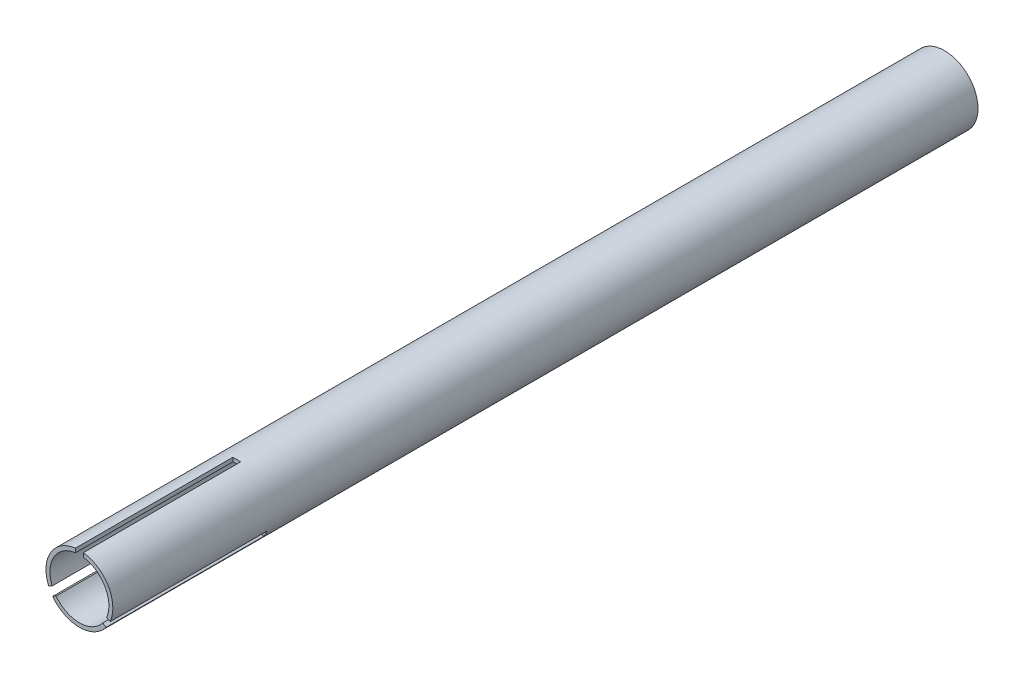
ISO-10303-21;
HEADER;
FILE_DESCRIPTION(('STEP AP214'),'2;1');
FILE_NAME('part.step','',(''),(''),'','','');
FILE_SCHEMA(('AUTOMOTIVE_DESIGN { 1 0 10303 214 1 1 1 1 }'));
ENDSEC;
DATA;
#1=APPLICATION_CONTEXT('core data for automotive mechanical design processes');
#2=APPLICATION_PROTOCOL_DEFINITION('international standard','automotive_design',2000,#1);
#3=PRODUCT_CONTEXT('',#1,'mechanical');
#4=PRODUCT('Part','Part','',(#3));
#5=PRODUCT_RELATED_PRODUCT_CATEGORY('part','',(#4));
#6=PRODUCT_DEFINITION_FORMATION('','',#4);
#7=PRODUCT_DEFINITION_CONTEXT('part definition',#1,'design');
#8=PRODUCT_DEFINITION('design','',#6,#7);
#9=PRODUCT_DEFINITION_SHAPE('','',#8);
#10=(LENGTH_UNIT() NAMED_UNIT(*) SI_UNIT(.MILLI.,.METRE.));
#11=(NAMED_UNIT(*) PLANE_ANGLE_UNIT() SI_UNIT($,.RADIAN.));
#12=(NAMED_UNIT(*) SI_UNIT($,.STERADIAN.) SOLID_ANGLE_UNIT());
#13=UNCERTAINTY_MEASURE_WITH_UNIT(LENGTH_MEASURE(1.E-05),#10,'distance_accuracy_value','');
#14=(GEOMETRIC_REPRESENTATION_CONTEXT(3) GLOBAL_UNCERTAINTY_ASSIGNED_CONTEXT((#13)) GLOBAL_UNIT_ASSIGNED_CONTEXT((#10,
#11,#12)) REPRESENTATION_CONTEXT('',''));
#15=CARTESIAN_POINT('',(0.,0.,0.));
#16=DIRECTION('',(0.,0.,1.));
#17=DIRECTION('',(1.,0.,0.));
#18=AXIS2_PLACEMENT_3D('',#15,#16,#17);
#19=CARTESIAN_POINT('',(0.,0.,558.8));
#20=DIRECTION('',(0.,0.,1.));
#21=DIRECTION('',(1.,0.,0.));
#22=AXIS2_PLACEMENT_3D('',#19,#20,#21);
#23=PLANE('',#22);
#24=CARTESIAN_POINT('',(0.,0.,558.8));
#25=DIRECTION('',(0.,0.,1.));
#26=DIRECTION('',(1.,0.,0.));
#27=AXIS2_PLACEMENT_3D('',#24,#25,#26);
#28=CIRCLE('',#27,19.05);
#29=CARTESIAN_POINT('',(-15.0804793507713,-11.6396581801598,558.8));
#30=VERTEX_POINT('',#29);
#31=CARTESIAN_POINT('',(15.0804793507715,-11.6396581801596,558.8));
#32=VERTEX_POINT('',#31);
#33=EDGE_CURVE('E257',#30,#32,#28,.T.);
#34=ORIENTED_EDGE('',*,*,#33,.F.);
#35=DIRECTION('',(0.866025403784436,0.500000000000004,0.));
#36=VECTOR('',#35,1.);
#37=CARTESIAN_POINT('',(-24.2724272465549,-16.9466317721675,558.8));
#38=LINE('',#37,#36);
#39=CARTESIAN_POINT('',(-17.297643226861,-12.9197383408577,558.8));
#40=VERTEX_POINT('',#39);
#41=EDGE_CURVE('E157',#40,#30,#38,.T.);
#42=ORIENTED_EDGE('',*,*,#41,.F.);
#43=CARTESIAN_POINT('',(0.,0.,558.8));
#44=DIRECTION('',(0.,0.,1.));
#45=DIRECTION('',(1.,0.,0.));
#46=AXIS2_PLACEMENT_3D('',#43,#44,#45);
#47=CIRCLE('',#46,21.59);
#48=CARTESIAN_POINT('',(17.2976432268612,-12.9197383408575,558.8));
#49=VERTEX_POINT('',#48);
#50=EDGE_CURVE('E54',#40,#49,#47,.T.);
#51=ORIENTED_EDGE('',*,*,#50,.T.);
#52=DIRECTION('',(-0.866025403784443,0.499999999999992,0.));
#53=VECTOR('',#52,1.);
#54=CARTESIAN_POINT('',(24.272427246555,-16.9466317721671,558.8));
#55=LINE('',#54,#53);
#56=EDGE_CURVE('E208',#49,#32,#55,.T.);
#57=ORIENTED_EDGE('',*,*,#56,.T.);
#58=EDGE_LOOP('',(#34,#42,#51,#57));
#59=FACE_BOUND('',#58,.T.);
#60=ADVANCED_FACE('F44',(#59),#23,.T.);
#61=CARTESIAN_POINT('',(-2.54,21.4400676304903,558.8));
#62=VERTEX_POINT('',#61);
#63=CARTESIAN_POINT('',(-19.837643226861,-8.52032928963279,558.8));
#64=VERTEX_POINT('',#63);
#65=EDGE_CURVE('E11',#62,#64,#47,.T.);
#66=ORIENTED_EDGE('',*,*,#65,.T.);
#67=DIRECTION('',(0.866025403784436,0.500000000000004,0.));
#68=VECTOR('',#67,1.);
#69=CARTESIAN_POINT('',(-26.8124272465549,-12.5472227209426,558.8));
#70=LINE('',#69,#68);
#71=CARTESIAN_POINT('',(-17.6204793507713,-7.24024912893486,558.8));
#72=VERTEX_POINT('',#71);
#73=EDGE_CURVE('E148',#64,#72,#70,.T.);
#74=ORIENTED_EDGE('',*,*,#73,.T.);
#75=CARTESIAN_POINT('',(-2.54,18.8799073090945,558.8));
#76=VERTEX_POINT('',#75);
#77=EDGE_CURVE('E163',#76,#72,#28,.T.);
#78=ORIENTED_EDGE('',*,*,#77,.F.);
#79=DIRECTION('',(0.,-1.,0.));
#80=VECTOR('',#79,1.);
#81=CARTESIAN_POINT('',(-2.54,21.591,558.8));
#82=LINE('',#81,#80);
#83=EDGE_CURVE('E243',#62,#76,#82,.T.);
#84=ORIENTED_EDGE('',*,*,#83,.F.);
#85=EDGE_LOOP('',(#66,#74,#78,#84));
#86=FACE_BOUND('',#85,.T.);
#87=ADVANCED_FACE('F308',(#86),#23,.T.);
#88=CARTESIAN_POINT('',(17.6204793507714,-7.24024912893461,558.8));
#89=VERTEX_POINT('',#88);
#90=CARTESIAN_POINT('',(2.54,18.8799073090945,558.8));
#91=VERTEX_POINT('',#90);
#92=EDGE_CURVE('E258',#89,#91,#28,.T.);
#93=ORIENTED_EDGE('',*,*,#92,.F.);
#94=DIRECTION('',(-0.866025403784443,0.499999999999992,0.));
#95=VECTOR('',#94,1.);
#96=CARTESIAN_POINT('',(26.812427246555,-12.5472227209421,558.8));
#97=LINE('',#96,#95);
#98=CARTESIAN_POINT('',(19.8376432268612,-8.52032928963251,558.8));
#99=VERTEX_POINT('',#98);
#100=EDGE_CURVE('E212',#99,#89,#97,.T.);
#101=ORIENTED_EDGE('',*,*,#100,.F.);
#102=CARTESIAN_POINT('',(2.54,21.4400676304903,558.8));
#103=VERTEX_POINT('',#102);
#104=EDGE_CURVE('E55',#99,#103,#47,.T.);
#105=ORIENTED_EDGE('',*,*,#104,.T.);
#106=DIRECTION('',(0.,-1.,0.));
#107=VECTOR('',#106,1.);
#108=CARTESIAN_POINT('',(2.54,21.591,558.8));
#109=LINE('',#108,#107);
#110=EDGE_CURVE('E239',#103,#91,#109,.T.);
#111=ORIENTED_EDGE('',*,*,#110,.T.);
#112=EDGE_LOOP('',(#93,#101,#105,#111));
#113=FACE_BOUND('',#112,.T.);
#114=ADVANCED_FACE('F285',(#113),#23,.T.);
#115=CARTESIAN_POINT('',(0.,0.,558.8));
#116=DIRECTION('',(0.,0.,-1.));
#117=DIRECTION('',(-1.,0.,0.));
#118=AXIS2_PLACEMENT_3D('',#115,#116,#117);
#119=CYLINDRICAL_SURFACE('',#118,21.59);
#120=CARTESIAN_POINT('',(0.,0.,0.));
#121=DIRECTION('',(0.,0.,1.));
#122=DIRECTION('',(1.,0.,0.));
#123=AXIS2_PLACEMENT_3D('',#120,#121,#122);
#124=CIRCLE('',#123,21.59);
#125=CARTESIAN_POINT('',(21.59,0.,0.));
#126=VERTEX_POINT('',#125);
#127=EDGE_CURVE('E48',#126,#126,#124,.T.);
#128=ORIENTED_EDGE('',*,*,#127,.T.);
#129=EDGE_LOOP('',(#128));
#130=FACE_BOUND('',#129,.T.);
#131=DIRECTION('',(0.,0.,-1.));
#132=VECTOR('',#131,1.);
#133=CARTESIAN_POINT('',(-17.297643226861,-12.9197383408577,558.8));
#134=LINE('',#133,#132);
#135=CARTESIAN_POINT('',(-17.297643226861,-12.9197383408577,457.2));
#136=VERTEX_POINT('',#135);
#137=EDGE_CURVE('E176',#40,#136,#134,.T.);
#138=ORIENTED_EDGE('',*,*,#137,.T.);
#139=CARTESIAN_POINT('',(0.,0.,457.2));
#140=DIRECTION('',(0.,0.,1.));
#141=DIRECTION('',(1.,0.,0.));
#142=AXIS2_PLACEMENT_3D('',#139,#140,#141);
#143=CIRCLE('',#142,21.59);
#144=CARTESIAN_POINT('',(-19.837643226861,-8.52032928963279,457.2));
#145=VERTEX_POINT('',#144);
#146=EDGE_CURVE('E156',#136,#145,#143,.F.);
#147=ORIENTED_EDGE('',*,*,#146,.T.);
#148=DIRECTION('',(0.,0.,-1.));
#149=VECTOR('',#148,1.);
#150=CARTESIAN_POINT('',(-19.837643226861,-8.52032928963279,558.8));
#151=LINE('',#150,#149);
#152=EDGE_CURVE('E144',#145,#64,#151,.F.);
#153=ORIENTED_EDGE('',*,*,#152,.T.);
#154=ORIENTED_EDGE('',*,*,#65,.F.);
#155=DIRECTION('',(0.,0.,-1.));
#156=VECTOR('',#155,1.);
#157=CARTESIAN_POINT('',(-2.54,21.4400676304903,558.8));
#158=LINE('',#157,#156);
#159=CARTESIAN_POINT('',(-2.54,21.4400676304903,457.2));
#160=VERTEX_POINT('',#159);
#161=EDGE_CURVE('E228',#62,#160,#158,.T.);
#162=ORIENTED_EDGE('',*,*,#161,.T.);
#163=CARTESIAN_POINT('',(0.,0.,457.2));
#164=DIRECTION('',(0.,0.,1.));
#165=DIRECTION('',(1.,0.,0.));
#166=AXIS2_PLACEMENT_3D('',#163,#164,#165);
#167=CIRCLE('',#166,21.59);
#168=CARTESIAN_POINT('',(2.54,21.4400676304903,457.2));
#169=VERTEX_POINT('',#168);
#170=EDGE_CURVE('E250',#160,#169,#167,.F.);
#171=ORIENTED_EDGE('',*,*,#170,.T.);
#172=DIRECTION('',(0.,0.,-1.));
#173=VECTOR('',#172,1.);
#174=CARTESIAN_POINT('',(2.54,21.4400676304903,558.8));
#175=LINE('',#174,#173);
#176=EDGE_CURVE('E224',#169,#103,#175,.F.);
#177=ORIENTED_EDGE('',*,*,#176,.T.);
#178=ORIENTED_EDGE('',*,*,#104,.F.);
#179=DIRECTION('',(0.,0.,-1.));
#180=VECTOR('',#179,1.);
#181=CARTESIAN_POINT('',(19.8376432268612,-8.52032928963251,558.8));
#182=LINE('',#181,#180);
#183=CARTESIAN_POINT('',(19.8376432268612,-8.52032928963251,457.2));
#184=VERTEX_POINT('',#183);
#185=EDGE_CURVE('E198',#99,#184,#182,.T.);
#186=ORIENTED_EDGE('',*,*,#185,.T.);
#187=CARTESIAN_POINT('',(0.,0.,457.2));
#188=DIRECTION('',(0.,0.,1.));
#189=DIRECTION('',(1.,0.,0.));
#190=AXIS2_PLACEMENT_3D('',#187,#188,#189);
#191=CIRCLE('',#190,21.59);
#192=CARTESIAN_POINT('',(17.2976432268612,-12.9197383408575,457.2));
#193=VERTEX_POINT('',#192);
#194=EDGE_CURVE('E165',#184,#193,#191,.F.);
#195=ORIENTED_EDGE('',*,*,#194,.T.);
#196=DIRECTION('',(0.,0.,-1.));
#197=VECTOR('',#196,1.);
#198=CARTESIAN_POINT('',(17.2976432268612,-12.9197383408575,558.8));
#199=LINE('',#198,#197);
#200=EDGE_CURVE('E194',#193,#49,#199,.F.);
#201=ORIENTED_EDGE('',*,*,#200,.T.);
#202=ORIENTED_EDGE('',*,*,#50,.F.);
#203=EDGE_LOOP('',(#138,#147,#153,#154,#162,#171,#177,#178,#186,#195,#201,#202));
#204=FACE_BOUND('',#203,.T.);
#205=ADVANCED_FACE('F46',(#130,#204),#119,.T.);
#206=CARTESIAN_POINT('',(0.,0.,558.8));
#207=DIRECTION('',(0.,0.,-1.));
#208=DIRECTION('',(-1.,0.,0.));
#209=AXIS2_PLACEMENT_3D('',#206,#207,#208);
#210=CYLINDRICAL_SURFACE('',#209,19.05);
#211=CARTESIAN_POINT('',(0.,0.,0.));
#212=DIRECTION('',(0.,0.,1.));
#213=DIRECTION('',(1.,0.,0.));
#214=AXIS2_PLACEMENT_3D('',#211,#212,#213);
#215=CIRCLE('',#214,19.05);
#216=CARTESIAN_POINT('',(19.05,0.,0.));
#217=VERTEX_POINT('',#216);
#218=EDGE_CURVE('E254',#217,#217,#215,.T.);
#219=ORIENTED_EDGE('',*,*,#218,.F.);
#220=EDGE_LOOP('',(#219));
#221=FACE_BOUND('',#220,.T.);
#222=CARTESIAN_POINT('',(0.,0.,457.2));
#223=DIRECTION('',(0.,0.,1.));
#224=DIRECTION('',(1.,0.,0.));
#225=AXIS2_PLACEMENT_3D('',#222,#223,#224);
#226=CIRCLE('',#225,19.05);
#227=CARTESIAN_POINT('',(-15.0804793507713,-11.6396581801598,457.2));
#228=VERTEX_POINT('',#227);
#229=CARTESIAN_POINT('',(-17.6204793507713,-7.24024912893486,457.2));
#230=VERTEX_POINT('',#229);
#231=EDGE_CURVE('E152',#228,#230,#226,.F.);
#232=ORIENTED_EDGE('',*,*,#231,.F.);
#233=DIRECTION('',(0.,0.,-1.));
#234=VECTOR('',#233,1.);
#235=CARTESIAN_POINT('',(-15.0804793507713,-11.6396581801598,558.8));
#236=LINE('',#235,#234);
#237=EDGE_CURVE('E62',#30,#228,#236,.T.);
#238=ORIENTED_EDGE('',*,*,#237,.F.);
#239=ORIENTED_EDGE('',*,*,#33,.T.);
#240=DIRECTION('',(0.,0.,-1.));
#241=VECTOR('',#240,1.);
#242=CARTESIAN_POINT('',(15.0804793507715,-11.6396581801596,558.8));
#243=LINE('',#242,#241);
#244=CARTESIAN_POINT('',(15.0804793507715,-11.6396581801596,457.2));
#245=VERTEX_POINT('',#244);
#246=EDGE_CURVE('E189',#245,#32,#243,.F.);
#247=ORIENTED_EDGE('',*,*,#246,.F.);
#248=CARTESIAN_POINT('',(0.,0.,457.2));
#249=DIRECTION('',(0.,0.,1.));
#250=DIRECTION('',(1.,0.,0.));
#251=AXIS2_PLACEMENT_3D('',#248,#249,#250);
#252=CIRCLE('',#251,19.05);
#253=CARTESIAN_POINT('',(17.6204793507714,-7.24024912893461,457.2));
#254=VERTEX_POINT('',#253);
#255=EDGE_CURVE('E171',#254,#245,#252,.F.);
#256=ORIENTED_EDGE('',*,*,#255,.F.);
#257=DIRECTION('',(0.,0.,-1.));
#258=VECTOR('',#257,1.);
#259=CARTESIAN_POINT('',(17.6204793507714,-7.24024912893461,558.8));
#260=LINE('',#259,#258);
#261=EDGE_CURVE('E70',#89,#254,#260,.T.);
#262=ORIENTED_EDGE('',*,*,#261,.F.);
#263=ORIENTED_EDGE('',*,*,#92,.T.);
#264=DIRECTION('',(0.,0.,-1.));
#265=VECTOR('',#264,1.);
#266=CARTESIAN_POINT('',(2.54,18.8799073090945,558.8));
#267=LINE('',#266,#265);
#268=CARTESIAN_POINT('',(2.54,18.8799073090945,457.2));
#269=VERTEX_POINT('',#268);
#270=EDGE_CURVE('E188',#269,#91,#267,.F.);
#271=ORIENTED_EDGE('',*,*,#270,.F.);
#272=CARTESIAN_POINT('',(0.,0.,457.2));
#273=DIRECTION('',(0.,0.,1.));
#274=DIRECTION('',(1.,0.,0.));
#275=AXIS2_PLACEMENT_3D('',#272,#273,#274);
#276=CIRCLE('',#275,19.05);
#277=CARTESIAN_POINT('',(-2.54,18.8799073090945,457.2));
#278=VERTEX_POINT('',#277);
#279=EDGE_CURVE('E246',#278,#269,#276,.F.);
#280=ORIENTED_EDGE('',*,*,#279,.F.);
#281=DIRECTION('',(0.,0.,-1.));
#282=VECTOR('',#281,1.);
#283=CARTESIAN_POINT('',(-2.54,18.8799073090945,558.8));
#284=LINE('',#283,#282);
#285=EDGE_CURVE('E221',#76,#278,#284,.T.);
#286=ORIENTED_EDGE('',*,*,#285,.F.);
#287=ORIENTED_EDGE('',*,*,#77,.T.);
#288=DIRECTION('',(0.,0.,-1.));
#289=VECTOR('',#288,1.);
#290=CARTESIAN_POINT('',(-17.6204793507713,-7.24024912893486,558.8));
#291=LINE('',#290,#289);
#292=EDGE_CURVE('E141',#230,#72,#291,.F.);
#293=ORIENTED_EDGE('',*,*,#292,.F.);
#294=EDGE_LOOP('',(#232,#238,#239,#247,#256,#262,#263,#271,#280,#286,#287,#293));
#295=FACE_BOUND('',#294,.T.);
#296=ADVANCED_FACE('F160',(#221,#295),#210,.F.);
#297=CARTESIAN_POINT('',(0.,0.,0.));
#298=DIRECTION('',(0.,0.,1.));
#299=DIRECTION('',(1.,0.,0.));
#300=AXIS2_PLACEMENT_3D('',#297,#298,#299);
#301=PLANE('',#300);
#302=ORIENTED_EDGE('',*,*,#127,.F.);
#303=EDGE_LOOP('',(#302));
#304=FACE_BOUND('',#303,.T.);
#305=ORIENTED_EDGE('',*,*,#218,.T.);
#306=EDGE_LOOP('',(#305));
#307=FACE_BOUND('',#306,.T.);
#308=ADVANCED_FACE('F294',(#304,#307),#301,.F.);
#309=CARTESIAN_POINT('',(-2.54,21.591,558.8));
#310=DIRECTION('',(1.,0.,0.));
#311=DIRECTION('',(0.,0.,-1.));
#312=AXIS2_PLACEMENT_3D('',#309,#310,#311);
#313=PLANE('',#312);
#314=ORIENTED_EDGE('',*,*,#83,.T.);
#315=ORIENTED_EDGE('',*,*,#285,.T.);
#316=DIRECTION('',(0.,-1.,0.));
#317=VECTOR('',#316,1.);
#318=CARTESIAN_POINT('',(-2.54,21.591,457.2));
#319=LINE('',#318,#317);
#320=EDGE_CURVE('E232',#160,#278,#319,.T.);
#321=ORIENTED_EDGE('',*,*,#320,.F.);
#322=ORIENTED_EDGE('',*,*,#161,.F.);
#323=EDGE_LOOP('',(#314,#315,#321,#322));
#324=FACE_BOUND('',#323,.T.);
#325=ADVANCED_FACE('F296',(#324),#313,.T.);
#326=CARTESIAN_POINT('',(2.54,21.591,558.8));
#327=DIRECTION('',(-1.,0.,0.));
#328=DIRECTION('',(0.,0.,1.));
#329=AXIS2_PLACEMENT_3D('',#326,#327,#328);
#330=PLANE('',#329);
#331=DIRECTION('',(0.,-1.,0.));
#332=VECTOR('',#331,1.);
#333=CARTESIAN_POINT('',(2.54,21.591,457.2));
#334=LINE('',#333,#332);
#335=EDGE_CURVE('E236',#169,#269,#334,.T.);
#336=ORIENTED_EDGE('',*,*,#335,.T.);
#337=ORIENTED_EDGE('',*,*,#270,.T.);
#338=ORIENTED_EDGE('',*,*,#110,.F.);
#339=ORIENTED_EDGE('',*,*,#176,.F.);
#340=EDGE_LOOP('',(#336,#337,#338,#339));
#341=FACE_BOUND('',#340,.T.);
#342=ADVANCED_FACE('F300',(#341),#330,.T.);
#343=CARTESIAN_POINT('',(-2.54,21.591,457.2));
#344=DIRECTION('',(0.,0.,1.));
#345=DIRECTION('',(1.,0.,0.));
#346=AXIS2_PLACEMENT_3D('',#343,#344,#345);
#347=PLANE('',#346);
#348=ORIENTED_EDGE('',*,*,#320,.T.);
#349=ORIENTED_EDGE('',*,*,#279,.T.);
#350=ORIENTED_EDGE('',*,*,#335,.F.);
#351=ORIENTED_EDGE('',*,*,#170,.F.);
#352=EDGE_LOOP('',(#348,#349,#350,#351));
#353=FACE_BOUND('',#352,.T.);
#354=ADVANCED_FACE('F332',(#353),#347,.T.);
#355=CARTESIAN_POINT('',(26.812427246555,-12.5472227209421,558.8));
#356=DIRECTION('',(-0.499999999999992,-0.866025403784443,0.));
#357=DIRECTION('',(0.866025403784443,-0.499999999999992,0.));
#358=AXIS2_PLACEMENT_3D('',#355,#356,#357);
#359=PLANE('',#358);
#360=ORIENTED_EDGE('',*,*,#100,.T.);
#361=ORIENTED_EDGE('',*,*,#261,.T.);
#362=DIRECTION('',(-0.866025403784443,0.499999999999992,0.));
#363=VECTOR('',#362,1.);
#364=CARTESIAN_POINT('',(26.812427246555,-12.5472227209421,457.2));
#365=LINE('',#364,#363);
#366=EDGE_CURVE('E202',#184,#254,#365,.T.);
#367=ORIENTED_EDGE('',*,*,#366,.F.);
#368=ORIENTED_EDGE('',*,*,#185,.F.);
#369=EDGE_LOOP('',(#360,#361,#367,#368));
#370=FACE_BOUND('',#369,.T.);
#371=ADVANCED_FACE('F282',(#370),#359,.T.);
#372=CARTESIAN_POINT('',(24.272427246555,-16.9466317721671,558.8));
#373=DIRECTION('',(0.499999999999992,0.866025403784443,0.));
#374=DIRECTION('',(-0.866025403784443,0.499999999999992,0.));
#375=AXIS2_PLACEMENT_3D('',#372,#373,#374);
#376=PLANE('',#375);
#377=DIRECTION('',(-0.866025403784443,0.499999999999992,0.));
#378=VECTOR('',#377,1.);
#379=CARTESIAN_POINT('',(24.272427246555,-16.9466317721671,457.2));
#380=LINE('',#379,#378);
#381=EDGE_CURVE('E205',#193,#245,#380,.T.);
#382=ORIENTED_EDGE('',*,*,#381,.T.);
#383=ORIENTED_EDGE('',*,*,#246,.T.);
#384=ORIENTED_EDGE('',*,*,#56,.F.);
#385=ORIENTED_EDGE('',*,*,#200,.F.);
#386=EDGE_LOOP('',(#382,#383,#384,#385));
#387=FACE_BOUND('',#386,.T.);
#388=ADVANCED_FACE('F276',(#387),#376,.T.);
#389=CARTESIAN_POINT('',(26.812427246555,-12.5472227209421,457.2));
#390=DIRECTION('',(0.,0.,1.));
#391=DIRECTION('',(1.,0.,0.));
#392=AXIS2_PLACEMENT_3D('',#389,#390,#391);
#393=PLANE('',#392);
#394=ORIENTED_EDGE('',*,*,#366,.T.);
#395=ORIENTED_EDGE('',*,*,#255,.T.);
#396=ORIENTED_EDGE('',*,*,#381,.F.);
#397=ORIENTED_EDGE('',*,*,#194,.F.);
#398=EDGE_LOOP('',(#394,#395,#396,#397));
#399=FACE_BOUND('',#398,.T.);
#400=ADVANCED_FACE('F281',(#399),#393,.T.);
#401=CARTESIAN_POINT('',(-24.2724272465549,-16.9466317721675,558.8));
#402=DIRECTION('',(-0.500000000000004,0.866025403784436,0.));
#403=DIRECTION('',(-0.866025403784436,-0.500000000000004,0.));
#404=AXIS2_PLACEMENT_3D('',#401,#402,#403);
#405=PLANE('',#404);
#406=ORIENTED_EDGE('',*,*,#41,.T.);
#407=ORIENTED_EDGE('',*,*,#237,.T.);
#408=DIRECTION('',(0.866025403784436,0.500000000000004,0.));
#409=VECTOR('',#408,1.);
#410=CARTESIAN_POINT('',(-24.2724272465549,-16.9466317721675,457.2));
#411=LINE('',#410,#409);
#412=EDGE_CURVE('E149',#136,#228,#411,.T.);
#413=ORIENTED_EDGE('',*,*,#412,.F.);
#414=ORIENTED_EDGE('',*,*,#137,.F.);
#415=EDGE_LOOP('',(#406,#407,#413,#414));
#416=FACE_BOUND('',#415,.T.);
#417=ADVANCED_FACE('F348',(#416),#405,.T.);
#418=CARTESIAN_POINT('',(-26.8124272465549,-12.5472227209426,558.8));
#419=DIRECTION('',(0.500000000000004,-0.866025403784436,0.));
#420=DIRECTION('',(0.866025403784436,0.500000000000004,0.));
#421=AXIS2_PLACEMENT_3D('',#418,#419,#420);
#422=PLANE('',#421);
#423=DIRECTION('',(0.866025403784436,0.500000000000004,0.));
#424=VECTOR('',#423,1.);
#425=CARTESIAN_POINT('',(-26.8124272465549,-12.5472227209426,457.2));
#426=LINE('',#425,#424);
#427=EDGE_CURVE('E137',#145,#230,#426,.T.);
#428=ORIENTED_EDGE('',*,*,#427,.T.);
#429=ORIENTED_EDGE('',*,*,#292,.T.);
#430=ORIENTED_EDGE('',*,*,#73,.F.);
#431=ORIENTED_EDGE('',*,*,#152,.F.);
#432=EDGE_LOOP('',(#428,#429,#430,#431));
#433=FACE_BOUND('',#432,.T.);
#434=ADVANCED_FACE('F139',(#433),#422,.T.);
#435=CARTESIAN_POINT('',(-24.2724272465549,-16.9466317721675,457.2));
#436=DIRECTION('',(0.,0.,1.));
#437=DIRECTION('',(1.,0.,0.));
#438=AXIS2_PLACEMENT_3D('',#435,#436,#437);
#439=PLANE('',#438);
#440=ORIENTED_EDGE('',*,*,#412,.T.);
#441=ORIENTED_EDGE('',*,*,#231,.T.);
#442=ORIENTED_EDGE('',*,*,#427,.F.);
#443=ORIENTED_EDGE('',*,*,#146,.F.);
#444=EDGE_LOOP('',(#440,#441,#442,#443));
#445=FACE_BOUND('',#444,.T.);
#446=ADVANCED_FACE('F153',(#445),#439,.T.);
#447=CLOSED_SHELL('',(#60,#87,#114,#205,#296,#308,#325,#342,#354,#371,#388,#400,#417,#434,#446));
#448=MANIFOLD_SOLID_BREP('B2',#447);
#449=ADVANCED_BREP_SHAPE_REPRESENTATION('',(#18,#448),#14);
#450=SHAPE_DEFINITION_REPRESENTATION(#9,#449);
ENDSEC;
END-ISO-10303-21;
